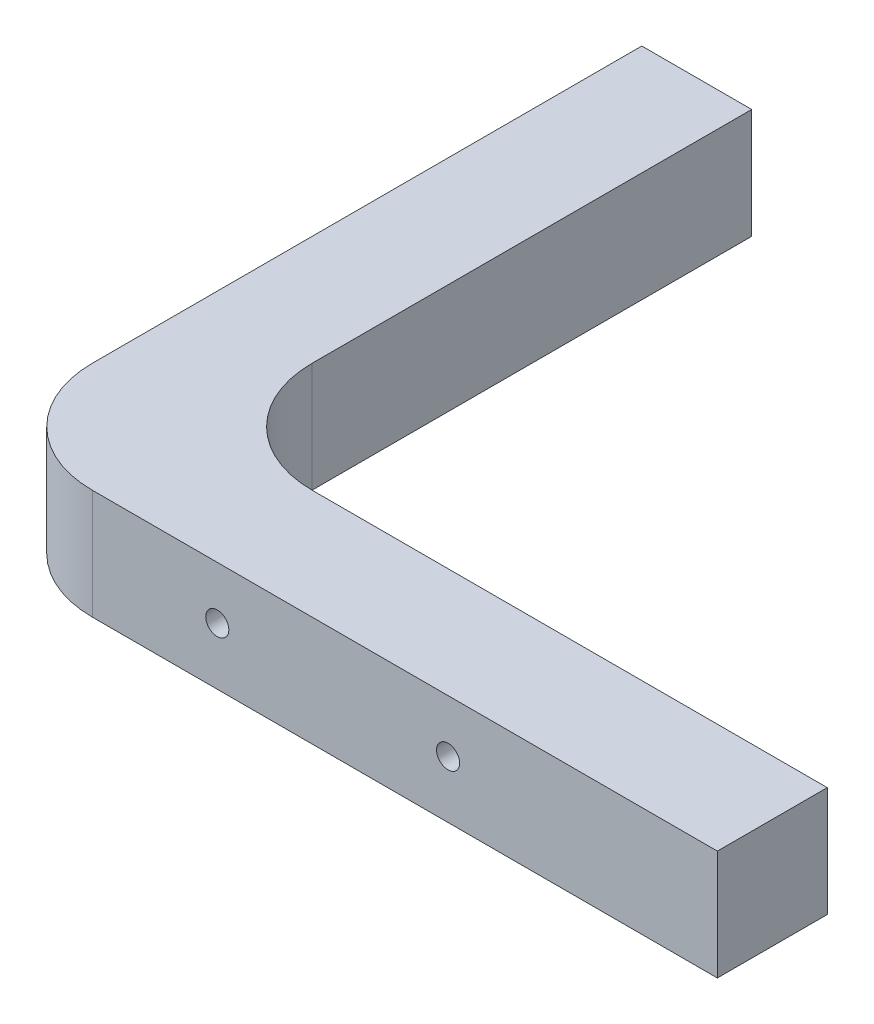
ISO-10303-21;
HEADER;
FILE_DESCRIPTION(('STEP AP214'),'2;1');
FILE_NAME('part.step','',(''),(''),'','','');
FILE_SCHEMA(('AUTOMOTIVE_DESIGN { 1 0 10303 214 1 1 1 1 }'));
ENDSEC;
DATA;
#1=APPLICATION_CONTEXT('core data for automotive mechanical design processes');
#2=APPLICATION_PROTOCOL_DEFINITION('international standard','automotive_design',2000,#1);
#3=PRODUCT_CONTEXT('',#1,'mechanical');
#4=PRODUCT('Part','Part','',(#3));
#5=PRODUCT_RELATED_PRODUCT_CATEGORY('part','',(#4));
#6=PRODUCT_DEFINITION_FORMATION('','',#4);
#7=PRODUCT_DEFINITION_CONTEXT('part definition',#1,'design');
#8=PRODUCT_DEFINITION('design','',#6,#7);
#9=PRODUCT_DEFINITION_SHAPE('','',#8);
#10=(LENGTH_UNIT() NAMED_UNIT(*) SI_UNIT(.MILLI.,.METRE.));
#11=(NAMED_UNIT(*) PLANE_ANGLE_UNIT() SI_UNIT($,.RADIAN.));
#12=(NAMED_UNIT(*) SI_UNIT($,.STERADIAN.) SOLID_ANGLE_UNIT());
#13=UNCERTAINTY_MEASURE_WITH_UNIT(LENGTH_MEASURE(1.E-05),#10,'distance_accuracy_value','');
#14=(GEOMETRIC_REPRESENTATION_CONTEXT(3) GLOBAL_UNCERTAINTY_ASSIGNED_CONTEXT((#13)) GLOBAL_UNIT_ASSIGNED_CONTEXT((#10,
#11,#12)) REPRESENTATION_CONTEXT('',''));
#15=CARTESIAN_POINT('',(0.,0.,0.));
#16=DIRECTION('',(0.,0.,1.));
#17=DIRECTION('',(1.,0.,0.));
#18=AXIS2_PLACEMENT_3D('',#15,#16,#17);
#19=CARTESIAN_POINT('',(23.1762566137566,20.,-66.7217813051148));
#20=DIRECTION('',(-1.,0.,0.));
#21=DIRECTION('',(0.,0.,1.));
#22=AXIS2_PLACEMENT_3D('',#19,#20,#21);
#23=PLANE('',#22);
#24=DIRECTION('',(0.,0.,-1.));
#25=VECTOR('',#24,1.);
#26=CARTESIAN_POINT('',(23.1762566137566,0.,-66.7217813051148));
#27=LINE('',#26,#25);
#28=CARTESIAN_POINT('',(23.1762566137566,0.,-46.7217813051148));
#29=VERTEX_POINT('',#28);
#30=CARTESIAN_POINT('',(23.1762566137566,0.,-66.7217813051148));
#31=VERTEX_POINT('',#30);
#32=EDGE_CURVE('E135',#29,#31,#27,.T.);
#33=ORIENTED_EDGE('',*,*,#32,.T.);
#34=DIRECTION('',(0.,-1.,0.));
#35=VECTOR('',#34,1.);
#36=CARTESIAN_POINT('',(23.1762566137566,20.,-66.7217813051148));
#37=LINE('',#36,#35);
#38=CARTESIAN_POINT('',(23.1762566137566,20.,-66.7217813051148));
#39=VERTEX_POINT('',#38);
#40=EDGE_CURVE('E11',#39,#31,#37,.T.);
#41=ORIENTED_EDGE('',*,*,#40,.F.);
#42=DIRECTION('',(0.,0.,-1.));
#43=VECTOR('',#42,1.);
#44=CARTESIAN_POINT('',(23.1762566137566,20.,-66.7217813051148));
#45=LINE('',#44,#43);
#46=CARTESIAN_POINT('',(23.1762566137566,20.,-46.7217813051148));
#47=VERTEX_POINT('',#46);
#48=EDGE_CURVE('E150',#47,#39,#45,.T.);
#49=ORIENTED_EDGE('',*,*,#48,.F.);
#50=DIRECTION('',(0.,-1.,0.));
#51=VECTOR('',#50,1.);
#52=CARTESIAN_POINT('',(23.1762566137566,20.,-46.7217813051148));
#53=LINE('',#52,#51);
#54=EDGE_CURVE('E131',#47,#29,#53,.T.);
#55=ORIENTED_EDGE('',*,*,#54,.T.);
#56=EDGE_LOOP('',(#33,#41,#49,#55));
#57=FACE_BOUND('',#56,.T.);
#58=ADVANCED_FACE('F39',(#57),#23,.F.);
#59=CARTESIAN_POINT('',(-70.5737433862432,20.,-66.7217813051147));
#60=DIRECTION('',(0.,0.,1.));
#61=DIRECTION('',(1.,0.,0.));
#62=AXIS2_PLACEMENT_3D('',#59,#60,#61);
#63=PLANE('',#62);
#64=CARTESIAN_POINT('',(-25.8237433862434,10.3976797733292,-66.7217813051147));
#65=DIRECTION('',(0.,0.,-1.));
#66=DIRECTION('',(-1.,0.,0.));
#67=AXIS2_PLACEMENT_3D('',#64,#65,#66);
#68=CIRCLE('',#67,2.1);
#69=CARTESIAN_POINT('',(-27.9237433862434,10.3976797733292,-66.7217813051147));
#70=VERTEX_POINT('',#69);
#71=EDGE_CURVE('E186',#70,#70,#68,.T.);
#72=ORIENTED_EDGE('',*,*,#71,.F.);
#73=EDGE_LOOP('',(#72));
#74=FACE_BOUND('',#73,.T.);
#75=CARTESIAN_POINT('',(-67.8237433862434,10.3976797733292,-66.7217813051147));
#76=DIRECTION('',(0.,0.,-1.));
#77=DIRECTION('',(1.,0.,0.));
#78=AXIS2_PLACEMENT_3D('',#75,#76,#77);
#79=CIRCLE('',#78,2.1);
#80=CARTESIAN_POINT('',(-69.9237433862434,10.3976797733292,-66.7217813051147));
#81=VERTEX_POINT('',#80);
#82=EDGE_CURVE('E183',#81,#81,#79,.T.);
#83=ORIENTED_EDGE('',*,*,#82,.F.);
#84=EDGE_LOOP('',(#83));
#85=FACE_BOUND('',#84,.T.);
#86=DIRECTION('',(-1.,0.,0.));
#87=VECTOR('',#86,1.);
#88=CARTESIAN_POINT('',(-70.5737433862432,0.,-66.7217813051147));
#89=LINE('',#88,#87);
#90=CARTESIAN_POINT('',(-70.5737433862434,0.,-66.7217813051147));
#91=VERTEX_POINT('',#90);
#92=EDGE_CURVE('E138',#31,#91,#89,.T.);
#93=ORIENTED_EDGE('',*,*,#92,.T.);
#94=DIRECTION('',(0.,-1.,0.));
#95=VECTOR('',#94,1.);
#96=CARTESIAN_POINT('',(-70.5737433862434,20.,-66.7217813051147));
#97=LINE('',#96,#95);
#98=CARTESIAN_POINT('',(-70.5737433862434,20.,-66.7217813051147));
#99=VERTEX_POINT('',#98);
#100=EDGE_CURVE('E47',#99,#91,#97,.T.);
#101=ORIENTED_EDGE('',*,*,#100,.F.);
#102=DIRECTION('',(-1.,0.,0.));
#103=VECTOR('',#102,1.);
#104=CARTESIAN_POINT('',(-70.5737433862432,20.,-66.7217813051147));
#105=LINE('',#104,#103);
#106=EDGE_CURVE('E98',#39,#99,#105,.T.);
#107=ORIENTED_EDGE('',*,*,#106,.F.);
#108=ORIENTED_EDGE('',*,*,#40,.T.);
#109=EDGE_LOOP('',(#93,#101,#107,#108));
#110=FACE_BOUND('',#109,.T.);
#111=ADVANCED_FACE('F197',(#74,#85,#110),#63,.F.);
#112=CARTESIAN_POINT('',(-70.5737433862434,20.,-86.7217813051147));
#113=DIRECTION('',(0.,-1.,0.));
#114=DIRECTION('',(0.,0.,-1.));
#115=AXIS2_PLACEMENT_3D('',#112,#113,#114);
#116=CYLINDRICAL_SURFACE('',#115,20.);
#117=CARTESIAN_POINT('',(-70.5737433862434,0.,-86.7217813051147));
#118=DIRECTION('',(0.,-1.,0.));
#119=DIRECTION('',(0.,0.,1.));
#120=AXIS2_PLACEMENT_3D('',#117,#118,#119);
#121=CIRCLE('',#120,20.);
#122=CARTESIAN_POINT('',(-90.5737433862434,0.,-86.7217813051149));
#123=VERTEX_POINT('',#122);
#124=EDGE_CURVE('E141',#91,#123,#121,.T.);
#125=ORIENTED_EDGE('',*,*,#124,.T.);
#126=DIRECTION('',(0.,-1.,0.));
#127=VECTOR('',#126,1.);
#128=CARTESIAN_POINT('',(-90.5737433862434,20.,-86.7217813051149));
#129=LINE('',#128,#127);
#130=CARTESIAN_POINT('',(-90.5737433862434,20.,-86.7217813051149));
#131=VERTEX_POINT('',#130);
#132=EDGE_CURVE('E157',#131,#123,#129,.T.);
#133=ORIENTED_EDGE('',*,*,#132,.F.);
#134=CARTESIAN_POINT('',(-70.5737433862434,20.,-86.7217813051147));
#135=DIRECTION('',(0.,-1.,0.));
#136=DIRECTION('',(0.,0.,1.));
#137=AXIS2_PLACEMENT_3D('',#134,#135,#136);
#138=CIRCLE('',#137,20.);
#139=EDGE_CURVE('E165',#99,#131,#138,.T.);
#140=ORIENTED_EDGE('',*,*,#139,.F.);
#141=ORIENTED_EDGE('',*,*,#100,.T.);
#142=EDGE_LOOP('',(#125,#133,#140,#141));
#143=FACE_BOUND('',#142,.T.);
#144=ADVANCED_FACE('F163',(#143),#116,.F.);
#145=CARTESIAN_POINT('',(-90.5737433862434,20.,-166.721781305115));
#146=DIRECTION('',(-1.,0.,0.));
#147=DIRECTION('',(0.,0.,1.));
#148=AXIS2_PLACEMENT_3D('',#145,#146,#147);
#149=PLANE('',#148);
#150=DIRECTION('',(0.,0.,-1.));
#151=VECTOR('',#150,1.);
#152=CARTESIAN_POINT('',(-90.5737433862434,0.,-166.721781305115));
#153=LINE('',#152,#151);
#154=CARTESIAN_POINT('',(-90.5737433862434,0.,-166.721781305115));
#155=VERTEX_POINT('',#154);
#156=EDGE_CURVE('E143',#123,#155,#153,.T.);
#157=ORIENTED_EDGE('',*,*,#156,.T.);
#158=DIRECTION('',(0.,-1.,0.));
#159=VECTOR('',#158,1.);
#160=CARTESIAN_POINT('',(-90.5737433862434,20.,-166.721781305115));
#161=LINE('',#160,#159);
#162=CARTESIAN_POINT('',(-90.5737433862434,20.,-166.721781305115));
#163=VERTEX_POINT('',#162);
#164=EDGE_CURVE('E154',#163,#155,#161,.T.);
#165=ORIENTED_EDGE('',*,*,#164,.F.);
#166=DIRECTION('',(0.,0.,-1.));
#167=VECTOR('',#166,1.);
#168=CARTESIAN_POINT('',(-90.5737433862434,20.,-166.721781305115));
#169=LINE('',#168,#167);
#170=EDGE_CURVE('E177',#131,#163,#169,.T.);
#171=ORIENTED_EDGE('',*,*,#170,.F.);
#172=ORIENTED_EDGE('',*,*,#132,.T.);
#173=EDGE_LOOP('',(#157,#165,#171,#172));
#174=FACE_BOUND('',#173,.T.);
#175=ADVANCED_FACE('F173',(#174),#149,.F.);
#176=CARTESIAN_POINT('',(-110.573743386243,20.,-166.721781305115));
#177=DIRECTION('',(0.,0.,1.));
#178=DIRECTION('',(1.,0.,0.));
#179=AXIS2_PLACEMENT_3D('',#176,#177,#178);
#180=PLANE('',#179);
#181=DIRECTION('',(-1.,0.,0.));
#182=VECTOR('',#181,1.);
#183=CARTESIAN_POINT('',(-110.573743386243,0.,-166.721781305115));
#184=LINE('',#183,#182);
#185=CARTESIAN_POINT('',(-110.573743386243,0.,-166.721781305115));
#186=VERTEX_POINT('',#185);
#187=EDGE_CURVE('E145',#155,#186,#184,.T.);
#188=ORIENTED_EDGE('',*,*,#187,.T.);
#189=DIRECTION('',(0.,-1.,0.));
#190=VECTOR('',#189,1.);
#191=CARTESIAN_POINT('',(-110.573743386243,20.,-166.721781305115));
#192=LINE('',#191,#190);
#193=CARTESIAN_POINT('',(-110.573743386243,20.,-166.721781305115));
#194=VERTEX_POINT('',#193);
#195=EDGE_CURVE('E126',#194,#186,#192,.T.);
#196=ORIENTED_EDGE('',*,*,#195,.F.);
#197=DIRECTION('',(-1.,0.,0.));
#198=VECTOR('',#197,1.);
#199=CARTESIAN_POINT('',(-110.573743386243,20.,-166.721781305115));
#200=LINE('',#199,#198);
#201=EDGE_CURVE('E117',#163,#194,#200,.T.);
#202=ORIENTED_EDGE('',*,*,#201,.F.);
#203=ORIENTED_EDGE('',*,*,#164,.T.);
#204=EDGE_LOOP('',(#188,#196,#202,#203));
#205=FACE_BOUND('',#204,.T.);
#206=ADVANCED_FACE('F176',(#205),#180,.F.);
#207=CARTESIAN_POINT('',(-110.573743386243,20.,-66.7217813051149));
#208=DIRECTION('',(1.,0.,0.));
#209=DIRECTION('',(0.,0.,-1.));
#210=AXIS2_PLACEMENT_3D('',#207,#208,#209);
#211=PLANE('',#210);
#212=DIRECTION('',(0.,0.,1.));
#213=VECTOR('',#212,1.);
#214=CARTESIAN_POINT('',(-110.573743386243,0.,-66.7217813051149));
#215=LINE('',#214,#213);
#216=CARTESIAN_POINT('',(-110.573743386243,0.,-66.7217813051149));
#217=VERTEX_POINT('',#216);
#218=EDGE_CURVE('E125',#186,#217,#215,.T.);
#219=ORIENTED_EDGE('',*,*,#218,.T.);
#220=DIRECTION('',(0.,-1.,0.));
#221=VECTOR('',#220,1.);
#222=CARTESIAN_POINT('',(-110.573743386243,20.,-66.7217813051149));
#223=LINE('',#222,#221);
#224=CARTESIAN_POINT('',(-110.573743386243,20.,-66.7217813051149));
#225=VERTEX_POINT('',#224);
#226=EDGE_CURVE('E122',#225,#217,#223,.T.);
#227=ORIENTED_EDGE('',*,*,#226,.F.);
#228=DIRECTION('',(0.,0.,1.));
#229=VECTOR('',#228,1.);
#230=CARTESIAN_POINT('',(-110.573743386243,20.,-66.7217813051149));
#231=LINE('',#230,#229);
#232=EDGE_CURVE('E111',#194,#225,#231,.T.);
#233=ORIENTED_EDGE('',*,*,#232,.F.);
#234=ORIENTED_EDGE('',*,*,#195,.T.);
#235=EDGE_LOOP('',(#219,#227,#233,#234));
#236=FACE_BOUND('',#235,.T.);
#237=ADVANCED_FACE('F123',(#236),#211,.F.);
#238=CARTESIAN_POINT('',(-90.5737433862434,20.,-66.7217813051147));
#239=DIRECTION('',(0.,-1.,0.));
#240=DIRECTION('',(0.,0.,-1.));
#241=AXIS2_PLACEMENT_3D('',#238,#239,#240);
#242=CYLINDRICAL_SURFACE('',#241,20.);
#243=CARTESIAN_POINT('',(-90.5737433862434,0.,-66.7217813051147));
#244=DIRECTION('',(0.,1.,0.));
#245=DIRECTION('',(0.,0.,-1.));
#246=AXIS2_PLACEMENT_3D('',#243,#244,#245);
#247=CIRCLE('',#246,20.);
#248=CARTESIAN_POINT('',(-90.5737433862433,0.,-46.7217813051147));
#249=VERTEX_POINT('',#248);
#250=EDGE_CURVE('E84',#217,#249,#247,.T.);
#251=ORIENTED_EDGE('',*,*,#250,.T.);
#252=DIRECTION('',(0.,-1.,0.));
#253=VECTOR('',#252,1.);
#254=CARTESIAN_POINT('',(-90.5737433862433,20.,-46.7217813051147));
#255=LINE('',#254,#253);
#256=CARTESIAN_POINT('',(-90.5737433862433,20.,-46.7217813051147));
#257=VERTEX_POINT('',#256);
#258=EDGE_CURVE('E127',#257,#249,#255,.T.);
#259=ORIENTED_EDGE('',*,*,#258,.F.);
#260=CARTESIAN_POINT('',(-90.5737433862434,20.,-66.7217813051147));
#261=DIRECTION('',(0.,1.,0.));
#262=DIRECTION('',(0.,0.,-1.));
#263=AXIS2_PLACEMENT_3D('',#260,#261,#262);
#264=CIRCLE('',#263,20.);
#265=EDGE_CURVE('E115',#225,#257,#264,.T.);
#266=ORIENTED_EDGE('',*,*,#265,.F.);
#267=ORIENTED_EDGE('',*,*,#226,.T.);
#268=EDGE_LOOP('',(#251,#259,#266,#267));
#269=FACE_BOUND('',#268,.T.);
#270=ADVANCED_FACE('F129',(#269),#242,.T.);
#271=CARTESIAN_POINT('',(23.1762566137566,20.,-46.7217813051148));
#272=DIRECTION('',(0.,0.,-1.));
#273=DIRECTION('',(-1.,0.,0.));
#274=AXIS2_PLACEMENT_3D('',#271,#272,#273);
#275=PLANE('',#274);
#276=CARTESIAN_POINT('',(-25.8237433862434,10.3976797733292,-46.7217813051147));
#277=DIRECTION('',(0.,0.,-1.));
#278=DIRECTION('',(-1.,0.,0.));
#279=AXIS2_PLACEMENT_3D('',#276,#277,#278);
#280=CIRCLE('',#279,2.1);
#281=CARTESIAN_POINT('',(-27.9237433862434,10.3976797733292,-46.7217813051147));
#282=VERTEX_POINT('',#281);
#283=EDGE_CURVE('E139',#282,#282,#280,.F.);
#284=ORIENTED_EDGE('',*,*,#283,.F.);
#285=EDGE_LOOP('',(#284));
#286=FACE_BOUND('',#285,.T.);
#287=CARTESIAN_POINT('',(-67.8237433862434,10.3976797733292,-46.7217813051147));
#288=DIRECTION('',(0.,0.,-1.));
#289=DIRECTION('',(-1.,0.,0.));
#290=AXIS2_PLACEMENT_3D('',#287,#288,#289);
#291=CIRCLE('',#290,2.1);
#292=CARTESIAN_POINT('',(-69.9237433862434,10.3976797733292,-46.7217813051147));
#293=VERTEX_POINT('',#292);
#294=EDGE_CURVE('E187',#293,#293,#291,.F.);
#295=ORIENTED_EDGE('',*,*,#294,.F.);
#296=EDGE_LOOP('',(#295));
#297=FACE_BOUND('',#296,.T.);
#298=DIRECTION('',(1.,0.,0.));
#299=VECTOR('',#298,1.);
#300=CARTESIAN_POINT('',(23.1762566137566,0.,-46.7217813051148));
#301=LINE('',#300,#299);
#302=EDGE_CURVE('E90',#249,#29,#301,.T.);
#303=ORIENTED_EDGE('',*,*,#302,.T.);
#304=ORIENTED_EDGE('',*,*,#54,.F.);
#305=DIRECTION('',(1.,0.,0.));
#306=VECTOR('',#305,1.);
#307=CARTESIAN_POINT('',(23.1762566137566,20.,-46.7217813051148));
#308=LINE('',#307,#306);
#309=EDGE_CURVE('E55',#257,#47,#308,.T.);
#310=ORIENTED_EDGE('',*,*,#309,.F.);
#311=ORIENTED_EDGE('',*,*,#258,.T.);
#312=EDGE_LOOP('',(#303,#304,#310,#311));
#313=FACE_BOUND('',#312,.T.);
#314=ADVANCED_FACE('F204',(#286,#297,#313),#275,.F.);
#315=CARTESIAN_POINT('',(-90.5737433862434,20.,-66.7217813051147));
#316=DIRECTION('',(0.,-1.,0.));
#317=DIRECTION('',(0.,0.,-1.));
#318=AXIS2_PLACEMENT_3D('',#315,#316,#317);
#319=PLANE('',#318);
#320=ORIENTED_EDGE('',*,*,#48,.T.);
#321=ORIENTED_EDGE('',*,*,#106,.T.);
#322=ORIENTED_EDGE('',*,*,#139,.T.);
#323=ORIENTED_EDGE('',*,*,#170,.T.);
#324=ORIENTED_EDGE('',*,*,#201,.T.);
#325=ORIENTED_EDGE('',*,*,#232,.T.);
#326=ORIENTED_EDGE('',*,*,#265,.T.);
#327=ORIENTED_EDGE('',*,*,#309,.T.);
#328=EDGE_LOOP('',(#320,#321,#322,#323,#324,#325,#326,#327));
#329=FACE_BOUND('',#328,.T.);
#330=ADVANCED_FACE('F113',(#329),#319,.F.);
#331=CARTESIAN_POINT('',(-90.5737433862434,0.,-66.7217813051147));
#332=DIRECTION('',(0.,-1.,0.));
#333=DIRECTION('',(0.,0.,-1.));
#334=AXIS2_PLACEMENT_3D('',#331,#332,#333);
#335=PLANE('',#334);
#336=ORIENTED_EDGE('',*,*,#32,.F.);
#337=ORIENTED_EDGE('',*,*,#302,.F.);
#338=ORIENTED_EDGE('',*,*,#250,.F.);
#339=ORIENTED_EDGE('',*,*,#218,.F.);
#340=ORIENTED_EDGE('',*,*,#187,.F.);
#341=ORIENTED_EDGE('',*,*,#156,.F.);
#342=ORIENTED_EDGE('',*,*,#124,.F.);
#343=ORIENTED_EDGE('',*,*,#92,.F.);
#344=EDGE_LOOP('',(#336,#337,#338,#339,#340,#341,#342,#343));
#345=FACE_BOUND('',#344,.T.);
#346=ADVANCED_FACE('F169',(#345),#335,.T.);
#347=CARTESIAN_POINT('',(-67.8237433862434,10.3976797733292,-40.7820843431477));
#348=DIRECTION('',(0.,0.,-1.));
#349=DIRECTION('',(-1.,0.,0.));
#350=AXIS2_PLACEMENT_3D('',#347,#348,#349);
#351=CYLINDRICAL_SURFACE('',#350,2.1);
#352=CARTESIAN_POINT('',(-69.9237433862434,10.3976797733292,-46.7217813051147));
#353=CARTESIAN_POINT('',(-69.9237433862434,10.3976797733292,-46.9301146384481));
#354=CARTESIAN_POINT('',(-69.9237433862434,10.3976797733292,-47.1384479717814));
#355=CARTESIAN_POINT('',(-69.9237433862434,10.3976797733292,-47.5551146384481));
#356=CARTESIAN_POINT('',(-69.9237433862434,10.3976797733292,-47.7634479717814));
#357=CARTESIAN_POINT('',(-69.9237433862434,10.3976797733292,-48.1801146384481));
#358=CARTESIAN_POINT('',(-69.9237433862434,10.3976797733292,-48.3884479717814));
#359=CARTESIAN_POINT('',(-69.9237433862434,10.3976797733292,-48.8051146384481));
#360=CARTESIAN_POINT('',(-69.9237433862434,10.3976797733292,-49.0134479717814));
#361=CARTESIAN_POINT('',(-69.9237433862434,10.3976797733292,-49.4301146384481));
#362=CARTESIAN_POINT('',(-69.9237433862434,10.3976797733292,-49.6384479717814));
#363=CARTESIAN_POINT('',(-69.9237433862434,10.3976797733292,-50.0551146384481));
#364=CARTESIAN_POINT('',(-69.9237433862434,10.3976797733292,-50.2634479717814));
#365=CARTESIAN_POINT('',(-69.9237433862434,10.3976797733292,-50.6801146384481));
#366=CARTESIAN_POINT('',(-69.9237433862434,10.3976797733292,-50.8884479717814));
#367=CARTESIAN_POINT('',(-69.9237433862434,10.3976797733292,-51.3051146384481));
#368=CARTESIAN_POINT('',(-69.9237433862434,10.3976797733292,-51.5134479717814));
#369=CARTESIAN_POINT('',(-69.9237433862434,10.3976797733292,-51.9301146384481));
#370=CARTESIAN_POINT('',(-69.9237433862434,10.3976797733292,-52.1384479717814));
#371=CARTESIAN_POINT('',(-69.9237433862434,10.3976797733292,-52.5551146384481));
#372=CARTESIAN_POINT('',(-69.9237433862434,10.3976797733292,-52.7634479717814));
#373=CARTESIAN_POINT('',(-69.9237433862434,10.3976797733292,-53.1801146384481));
#374=CARTESIAN_POINT('',(-69.9237433862434,10.3976797733292,-53.3884479717814));
#375=CARTESIAN_POINT('',(-69.9237433862434,10.3976797733292,-53.8051146384481));
#376=CARTESIAN_POINT('',(-69.9237433862434,10.3976797733292,-54.0134479717814));
#377=CARTESIAN_POINT('',(-69.9237433862434,10.3976797733292,-54.4301146384481));
#378=CARTESIAN_POINT('',(-69.9237433862434,10.3976797733292,-54.6384479717814));
#379=CARTESIAN_POINT('',(-69.9237433862434,10.3976797733292,-55.0551146384481));
#380=CARTESIAN_POINT('',(-69.9237433862434,10.3976797733292,-55.2634479717814));
#381=CARTESIAN_POINT('',(-69.9237433862434,10.3976797733292,-55.6801146384481));
#382=CARTESIAN_POINT('',(-69.9237433862434,10.3976797733292,-55.8884479717814));
#383=CARTESIAN_POINT('',(-69.9237433862434,10.3976797733292,-56.3051146384481));
#384=CARTESIAN_POINT('',(-69.9237433862434,10.3976797733292,-56.5134479717814));
#385=CARTESIAN_POINT('',(-69.9237433862434,10.3976797733292,-56.9301146384481));
#386=CARTESIAN_POINT('',(-69.9237433862434,10.3976797733292,-57.1384479717814));
#387=CARTESIAN_POINT('',(-69.9237433862434,10.3976797733292,-57.5551146384481));
#388=CARTESIAN_POINT('',(-69.9237433862434,10.3976797733292,-57.7634479717814));
#389=CARTESIAN_POINT('',(-69.9237433862434,10.3976797733292,-58.1801146384481));
#390=CARTESIAN_POINT('',(-69.9237433862434,10.3976797733292,-58.3884479717814));
#391=CARTESIAN_POINT('',(-69.9237433862434,10.3976797733292,-58.8051146384481));
#392=CARTESIAN_POINT('',(-69.9237433862434,10.3976797733292,-59.0134479717814));
#393=CARTESIAN_POINT('',(-69.9237433862434,10.3976797733292,-59.4301146384481));
#394=CARTESIAN_POINT('',(-69.9237433862434,10.3976797733292,-59.6384479717814));
#395=CARTESIAN_POINT('',(-69.9237433862434,10.3976797733292,-60.0551146384481));
#396=CARTESIAN_POINT('',(-69.9237433862434,10.3976797733292,-60.2634479717814));
#397=CARTESIAN_POINT('',(-69.9237433862434,10.3976797733292,-60.6801146384481));
#398=CARTESIAN_POINT('',(-69.9237433862434,10.3976797733292,-60.8884479717814));
#399=CARTESIAN_POINT('',(-69.9237433862434,10.3976797733292,-61.3051146384481));
#400=CARTESIAN_POINT('',(-69.9237433862434,10.3976797733292,-61.5134479717814));
#401=CARTESIAN_POINT('',(-69.9237433862434,10.3976797733292,-61.9301146384481));
#402=CARTESIAN_POINT('',(-69.9237433862434,10.3976797733292,-62.1384479717814));
#403=CARTESIAN_POINT('',(-69.9237433862434,10.3976797733292,-62.5551146384481));
#404=CARTESIAN_POINT('',(-69.9237433862434,10.3976797733292,-62.7634479717814));
#405=CARTESIAN_POINT('',(-69.9237433862434,10.3976797733292,-63.1801146384481));
#406=CARTESIAN_POINT('',(-69.9237433862434,10.3976797733292,-63.3884479717814));
#407=CARTESIAN_POINT('',(-69.9237433862434,10.3976797733292,-63.8051146384481));
#408=CARTESIAN_POINT('',(-69.9237433862434,10.3976797733292,-64.0134479717814));
#409=CARTESIAN_POINT('',(-69.9237433862434,10.3976797733292,-64.4301146384481));
#410=CARTESIAN_POINT('',(-69.9237433862434,10.3976797733292,-64.6384479717814));
#411=CARTESIAN_POINT('',(-69.9237433862434,10.3976797733292,-65.0551146384481));
#412=CARTESIAN_POINT('',(-69.9237433862434,10.3976797733292,-65.2634479717814));
#413=CARTESIAN_POINT('',(-69.9237433862434,10.3976797733292,-65.6801146384481));
#414=CARTESIAN_POINT('',(-69.9237433862434,10.3976797733292,-65.8884479717814));
#415=CARTESIAN_POINT('',(-69.9237433862434,10.3976797733292,-66.3051146384481));
#416=CARTESIAN_POINT('',(-69.9237433862434,10.3976797733292,-66.5134479717814));
#417=CARTESIAN_POINT('',(-69.9237433862434,10.3976797733292,-66.7217813051147));
#418=B_SPLINE_CURVE_WITH_KNOTS('',3,(#352,#353,#354,#355,#356,#357,#358,#359,#360,#361,#362,
#363,#364,#365,#366,#367,#368,#369,#370,#371,#372,#373,#374,#375,#376,#377,#378,#379,#380,#381,
#382,#383,#384,#385,#386,#387,#388,#389,#390,#391,#392,#393,#394,#395,#396,#397,#398,#399,#400,
#401,#402,#403,#404,#405,#406,#407,#408,#409,#410,#411,#412,#413,#414,#415,#416,#417),
.UNSPECIFIED.,.F.,.F.,(4,2,2,2,2,2,2,2,2,2,2,2,2,2,2,2,2,2,2,2,2,2,2,2,2,2,2,2,2,2,2,2,4),(0.,
0.625000000000001,1.24999999999999,1.87499999999999,2.5,3.125,3.75,4.375,5.,5.625,6.25,6.875,
7.5,8.125,8.75,9.375,10.,10.625,11.25,11.875,12.5,13.125,13.75,14.375,15.,15.625,16.25,16.875,
17.5,18.125,18.75,19.375,20.),.UNSPECIFIED.);
#419=EDGE_CURVE('BSEAM266',#293,#81,#418,.T.);
#420=ORIENTED_EDGE('',*,*,#294,.T.);
#421=ORIENTED_EDGE('',*,*,#82,.T.);
#422=ORIENTED_EDGE('',*,*,#419,.T.);
#423=ORIENTED_EDGE('',*,*,#419,.F.);
#424=EDGE_LOOP('',(#420,#422,#421,#423));
#425=FACE_BOUND('',#424,.T.);
#426=ADVANCED_FACE('F266',(#425),#351,.F.);
#427=CARTESIAN_POINT('',(-25.8237433862434,10.3976797733292,-40.7820843431477));
#428=DIRECTION('',(0.,0.,-1.));
#429=DIRECTION('',(-1.,0.,0.));
#430=AXIS2_PLACEMENT_3D('',#427,#428,#429);
#431=CYLINDRICAL_SURFACE('',#430,2.1);
#432=CARTESIAN_POINT('',(-27.9237433862434,10.3976797733292,-46.7217813051147));
#433=CARTESIAN_POINT('',(-27.9237433862434,10.3976797733292,-46.9301146384481));
#434=CARTESIAN_POINT('',(-27.9237433862434,10.3976797733292,-47.1384479717814));
#435=CARTESIAN_POINT('',(-27.9237433862434,10.3976797733292,-47.5551146384481));
#436=CARTESIAN_POINT('',(-27.9237433862434,10.3976797733292,-47.7634479717814));
#437=CARTESIAN_POINT('',(-27.9237433862434,10.3976797733292,-48.1801146384481));
#438=CARTESIAN_POINT('',(-27.9237433862434,10.3976797733292,-48.3884479717814));
#439=CARTESIAN_POINT('',(-27.9237433862434,10.3976797733292,-48.8051146384481));
#440=CARTESIAN_POINT('',(-27.9237433862434,10.3976797733292,-49.0134479717814));
#441=CARTESIAN_POINT('',(-27.9237433862434,10.3976797733292,-49.4301146384481));
#442=CARTESIAN_POINT('',(-27.9237433862434,10.3976797733292,-49.6384479717814));
#443=CARTESIAN_POINT('',(-27.9237433862434,10.3976797733292,-50.0551146384481));
#444=CARTESIAN_POINT('',(-27.9237433862434,10.3976797733292,-50.2634479717814));
#445=CARTESIAN_POINT('',(-27.9237433862434,10.3976797733292,-50.6801146384481));
#446=CARTESIAN_POINT('',(-27.9237433862434,10.3976797733292,-50.8884479717814));
#447=CARTESIAN_POINT('',(-27.9237433862434,10.3976797733292,-51.3051146384481));
#448=CARTESIAN_POINT('',(-27.9237433862434,10.3976797733292,-51.5134479717814));
#449=CARTESIAN_POINT('',(-27.9237433862434,10.3976797733292,-51.9301146384481));
#450=CARTESIAN_POINT('',(-27.9237433862434,10.3976797733292,-52.1384479717814));
#451=CARTESIAN_POINT('',(-27.9237433862434,10.3976797733292,-52.5551146384481));
#452=CARTESIAN_POINT('',(-27.9237433862434,10.3976797733292,-52.7634479717814));
#453=CARTESIAN_POINT('',(-27.9237433862434,10.3976797733292,-53.1801146384481));
#454=CARTESIAN_POINT('',(-27.9237433862434,10.3976797733292,-53.3884479717814));
#455=CARTESIAN_POINT('',(-27.9237433862434,10.3976797733292,-53.8051146384481));
#456=CARTESIAN_POINT('',(-27.9237433862434,10.3976797733292,-54.0134479717814));
#457=CARTESIAN_POINT('',(-27.9237433862434,10.3976797733292,-54.4301146384481));
#458=CARTESIAN_POINT('',(-27.9237433862434,10.3976797733292,-54.6384479717814));
#459=CARTESIAN_POINT('',(-27.9237433862434,10.3976797733292,-55.0551146384481));
#460=CARTESIAN_POINT('',(-27.9237433862434,10.3976797733292,-55.2634479717814));
#461=CARTESIAN_POINT('',(-27.9237433862434,10.3976797733292,-55.6801146384481));
#462=CARTESIAN_POINT('',(-27.9237433862434,10.3976797733292,-55.8884479717814));
#463=CARTESIAN_POINT('',(-27.9237433862434,10.3976797733292,-56.3051146384481));
#464=CARTESIAN_POINT('',(-27.9237433862434,10.3976797733292,-56.5134479717814));
#465=CARTESIAN_POINT('',(-27.9237433862434,10.3976797733292,-56.9301146384481));
#466=CARTESIAN_POINT('',(-27.9237433862434,10.3976797733292,-57.1384479717814));
#467=CARTESIAN_POINT('',(-27.9237433862434,10.3976797733292,-57.5551146384481));
#468=CARTESIAN_POINT('',(-27.9237433862434,10.3976797733292,-57.7634479717814));
#469=CARTESIAN_POINT('',(-27.9237433862434,10.3976797733292,-58.1801146384481));
#470=CARTESIAN_POINT('',(-27.9237433862434,10.3976797733292,-58.3884479717814));
#471=CARTESIAN_POINT('',(-27.9237433862434,10.3976797733292,-58.8051146384481));
#472=CARTESIAN_POINT('',(-27.9237433862434,10.3976797733292,-59.0134479717814));
#473=CARTESIAN_POINT('',(-27.9237433862434,10.3976797733292,-59.4301146384481));
#474=CARTESIAN_POINT('',(-27.9237433862434,10.3976797733292,-59.6384479717814));
#475=CARTESIAN_POINT('',(-27.9237433862434,10.3976797733292,-60.0551146384481));
#476=CARTESIAN_POINT('',(-27.9237433862434,10.3976797733292,-60.2634479717814));
#477=CARTESIAN_POINT('',(-27.9237433862434,10.3976797733292,-60.6801146384481));
#478=CARTESIAN_POINT('',(-27.9237433862434,10.3976797733292,-60.8884479717814));
#479=CARTESIAN_POINT('',(-27.9237433862434,10.3976797733292,-61.3051146384481));
#480=CARTESIAN_POINT('',(-27.9237433862434,10.3976797733292,-61.5134479717814));
#481=CARTESIAN_POINT('',(-27.9237433862434,10.3976797733292,-61.9301146384481));
#482=CARTESIAN_POINT('',(-27.9237433862434,10.3976797733292,-62.1384479717814));
#483=CARTESIAN_POINT('',(-27.9237433862434,10.3976797733292,-62.5551146384481));
#484=CARTESIAN_POINT('',(-27.9237433862434,10.3976797733292,-62.7634479717814));
#485=CARTESIAN_POINT('',(-27.9237433862434,10.3976797733292,-63.1801146384481));
#486=CARTESIAN_POINT('',(-27.9237433862434,10.3976797733292,-63.3884479717814));
#487=CARTESIAN_POINT('',(-27.9237433862434,10.3976797733292,-63.8051146384481));
#488=CARTESIAN_POINT('',(-27.9237433862434,10.3976797733292,-64.0134479717814));
#489=CARTESIAN_POINT('',(-27.9237433862434,10.3976797733292,-64.4301146384481));
#490=CARTESIAN_POINT('',(-27.9237433862434,10.3976797733292,-64.6384479717814));
#491=CARTESIAN_POINT('',(-27.9237433862434,10.3976797733292,-65.0551146384481));
#492=CARTESIAN_POINT('',(-27.9237433862434,10.3976797733292,-65.2634479717814));
#493=CARTESIAN_POINT('',(-27.9237433862434,10.3976797733292,-65.6801146384481));
#494=CARTESIAN_POINT('',(-27.9237433862434,10.3976797733292,-65.8884479717814));
#495=CARTESIAN_POINT('',(-27.9237433862434,10.3976797733292,-66.3051146384481));
#496=CARTESIAN_POINT('',(-27.9237433862434,10.3976797733292,-66.5134479717814));
#497=CARTESIAN_POINT('',(-27.9237433862434,10.3976797733292,-66.7217813051147));
#498=B_SPLINE_CURVE_WITH_KNOTS('',3,(#432,#433,#434,#435,#436,#437,#438,#439,#440,#441,#442,
#443,#444,#445,#446,#447,#448,#449,#450,#451,#452,#453,#454,#455,#456,#457,#458,#459,#460,#461,
#462,#463,#464,#465,#466,#467,#468,#469,#470,#471,#472,#473,#474,#475,#476,#477,#478,#479,#480,
#481,#482,#483,#484,#485,#486,#487,#488,#489,#490,#491,#492,#493,#494,#495,#496,#497),
.UNSPECIFIED.,.F.,.F.,(4,2,2,2,2,2,2,2,2,2,2,2,2,2,2,2,2,2,2,2,2,2,2,2,2,2,2,2,2,2,2,2,4),(0.,
0.625000000000001,1.25,1.875,2.5,3.125,3.75,4.375,5.,5.625,6.25,6.875,7.5,8.125,8.75,9.375,10.,
10.625,11.25,11.875,12.5,13.125,13.75,14.375,15.,15.625,16.25,16.875,17.5,18.125,18.75,19.375,
20.),.UNSPECIFIED.);
#499=EDGE_CURVE('BSEAM195',#282,#70,#498,.T.);
#500=ORIENTED_EDGE('',*,*,#283,.T.);
#501=ORIENTED_EDGE('',*,*,#71,.T.);
#502=ORIENTED_EDGE('',*,*,#499,.T.);
#503=ORIENTED_EDGE('',*,*,#499,.F.);
#504=EDGE_LOOP('',(#500,#502,#501,#503));
#505=FACE_BOUND('',#504,.T.);
#506=ADVANCED_FACE('F195',(#505),#431,.F.);
#507=CLOSED_SHELL('',(#58,#111,#144,#175,#206,#237,#270,#314,#330,#346,#426,#506));
#508=MANIFOLD_SOLID_BREP('B2',#507);
#509=ADVANCED_BREP_SHAPE_REPRESENTATION('',(#18,#508),#14);
#510=SHAPE_DEFINITION_REPRESENTATION(#9,#509);
ENDSEC;
END-ISO-10303-21;
